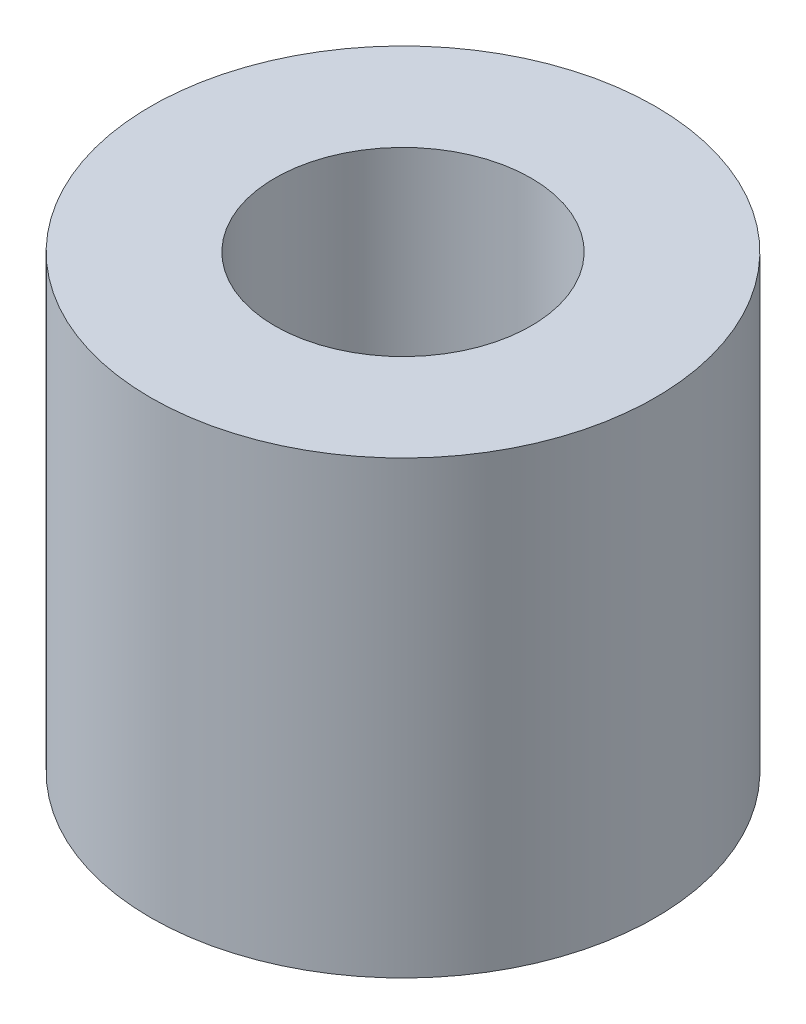
ISO-10303-21;
HEADER;
FILE_DESCRIPTION(('STEP AP214'),'2;1');
FILE_NAME('part.step','',(''),(''),'','','');
FILE_SCHEMA(('AUTOMOTIVE_DESIGN { 1 0 10303 214 1 1 1 1 }'));
ENDSEC;
DATA;
#1=APPLICATION_CONTEXT('core data for automotive mechanical design processes');
#2=APPLICATION_PROTOCOL_DEFINITION('international standard','automotive_design',2000,#1);
#3=PRODUCT_CONTEXT('',#1,'mechanical');
#4=PRODUCT('Part','Part','',(#3));
#5=PRODUCT_RELATED_PRODUCT_CATEGORY('part','',(#4));
#6=PRODUCT_DEFINITION_FORMATION('','',#4);
#7=PRODUCT_DEFINITION_CONTEXT('part definition',#1,'design');
#8=PRODUCT_DEFINITION('design','',#6,#7);
#9=PRODUCT_DEFINITION_SHAPE('','',#8);
#10=(LENGTH_UNIT() NAMED_UNIT(*) SI_UNIT(.MILLI.,.METRE.));
#11=(NAMED_UNIT(*) PLANE_ANGLE_UNIT() SI_UNIT($,.RADIAN.));
#12=(NAMED_UNIT(*) SI_UNIT($,.STERADIAN.) SOLID_ANGLE_UNIT());
#13=UNCERTAINTY_MEASURE_WITH_UNIT(LENGTH_MEASURE(1.E-05),#10,'distance_accuracy_value','');
#14=(GEOMETRIC_REPRESENTATION_CONTEXT(3) GLOBAL_UNCERTAINTY_ASSIGNED_CONTEXT((#13)) GLOBAL_UNIT_ASSIGNED_CONTEXT((#10,
#11,#12)) REPRESENTATION_CONTEXT('',''));
#15=CARTESIAN_POINT('',(0.,0.,0.));
#16=DIRECTION('',(0.,0.,1.));
#17=DIRECTION('',(1.,0.,0.));
#18=AXIS2_PLACEMENT_3D('',#15,#16,#17);
#19=CARTESIAN_POINT('',(0.,5.8,0.));
#20=DIRECTION('',(0.,1.,0.));
#21=DIRECTION('',(0.,0.,1.));
#22=AXIS2_PLACEMENT_3D('',#19,#20,#21);
#23=PLANE('',#22);
#24=CARTESIAN_POINT('',(0.,5.8,0.));
#25=DIRECTION('',(0.,1.,0.));
#26=DIRECTION('',(0.,0.,1.));
#27=AXIS2_PLACEMENT_3D('',#24,#25,#26);
#28=CIRCLE('',#27,3.25);
#29=CARTESIAN_POINT('',(0.,5.8,3.25));
#30=VERTEX_POINT('',#29);
#31=EDGE_CURVE('E10',#30,#30,#28,.T.);
#32=ORIENTED_EDGE('',*,*,#31,.T.);
#33=EDGE_LOOP('',(#32));
#34=FACE_BOUND('',#33,.T.);
#35=CARTESIAN_POINT('',(0.,5.8,0.));
#36=DIRECTION('',(0.,1.,0.));
#37=DIRECTION('',(0.,0.,1.));
#38=AXIS2_PLACEMENT_3D('',#35,#36,#37);
#39=CIRCLE('',#38,1.65);
#40=CARTESIAN_POINT('',(0.,5.8,1.65));
#41=VERTEX_POINT('',#40);
#42=EDGE_CURVE('E44',#41,#41,#39,.T.);
#43=ORIENTED_EDGE('',*,*,#42,.F.);
#44=EDGE_LOOP('',(#43));
#45=FACE_BOUND('',#44,.T.);
#46=ADVANCED_FACE('F33',(#34,#45),#23,.T.);
#47=CARTESIAN_POINT('',(0.,0.,0.));
#48=DIRECTION('',(0.,1.,0.));
#49=DIRECTION('',(0.,0.,1.));
#50=AXIS2_PLACEMENT_3D('',#47,#48,#49);
#51=PLANE('',#50);
#52=CARTESIAN_POINT('',(0.,0.,0.));
#53=DIRECTION('',(0.,1.,0.));
#54=DIRECTION('',(0.,0.,1.));
#55=AXIS2_PLACEMENT_3D('',#52,#53,#54);
#56=CIRCLE('',#55,3.25);
#57=CARTESIAN_POINT('',(0.,0.,3.25));
#58=VERTEX_POINT('',#57);
#59=EDGE_CURVE('E37',#58,#58,#56,.T.);
#60=ORIENTED_EDGE('',*,*,#59,.F.);
#61=EDGE_LOOP('',(#60));
#62=FACE_BOUND('',#61,.T.);
#63=CARTESIAN_POINT('',(0.,0.,0.));
#64=DIRECTION('',(0.,1.,0.));
#65=DIRECTION('',(0.,0.,1.));
#66=AXIS2_PLACEMENT_3D('',#63,#64,#65);
#67=CIRCLE('',#66,1.65);
#68=CARTESIAN_POINT('',(0.,0.,1.65));
#69=VERTEX_POINT('',#68);
#70=EDGE_CURVE('E46',#69,#69,#67,.T.);
#71=ORIENTED_EDGE('',*,*,#70,.T.);
#72=EDGE_LOOP('',(#71));
#73=FACE_BOUND('',#72,.T.);
#74=ADVANCED_FACE('F56',(#62,#73),#51,.F.);
#75=CARTESIAN_POINT('',(0.,5.8,0.));
#76=DIRECTION('',(0.,-1.,0.));
#77=DIRECTION('',(0.,0.,-1.));
#78=AXIS2_PLACEMENT_3D('',#75,#76,#77);
#79=CYLINDRICAL_SURFACE('',#78,3.25);
#80=ORIENTED_EDGE('',*,*,#31,.F.);
#81=EDGE_LOOP('',(#80));
#82=FACE_BOUND('',#81,.T.);
#83=ORIENTED_EDGE('',*,*,#59,.T.);
#84=EDGE_LOOP('',(#83));
#85=FACE_BOUND('',#84,.T.);
#86=ADVANCED_FACE('F35',(#82,#85),#79,.T.);
#87=CARTESIAN_POINT('',(0.,5.8,0.));
#88=DIRECTION('',(0.,-1.,0.));
#89=DIRECTION('',(0.,0.,-1.));
#90=AXIS2_PLACEMENT_3D('',#87,#88,#89);
#91=CYLINDRICAL_SURFACE('',#90,1.65);
#92=ORIENTED_EDGE('',*,*,#42,.T.);
#93=EDGE_LOOP('',(#92));
#94=FACE_BOUND('',#93,.T.);
#95=ORIENTED_EDGE('',*,*,#70,.F.);
#96=EDGE_LOOP('',(#95));
#97=FACE_BOUND('',#96,.T.);
#98=ADVANCED_FACE('F52',(#94,#97),#91,.F.);
#99=CLOSED_SHELL('',(#46,#74,#86,#98));
#100=MANIFOLD_SOLID_BREP('B2',#99);
#101=ADVANCED_BREP_SHAPE_REPRESENTATION('',(#18,#100),#14);
#102=SHAPE_DEFINITION_REPRESENTATION(#9,#101);
ENDSEC;
END-ISO-10303-21;
